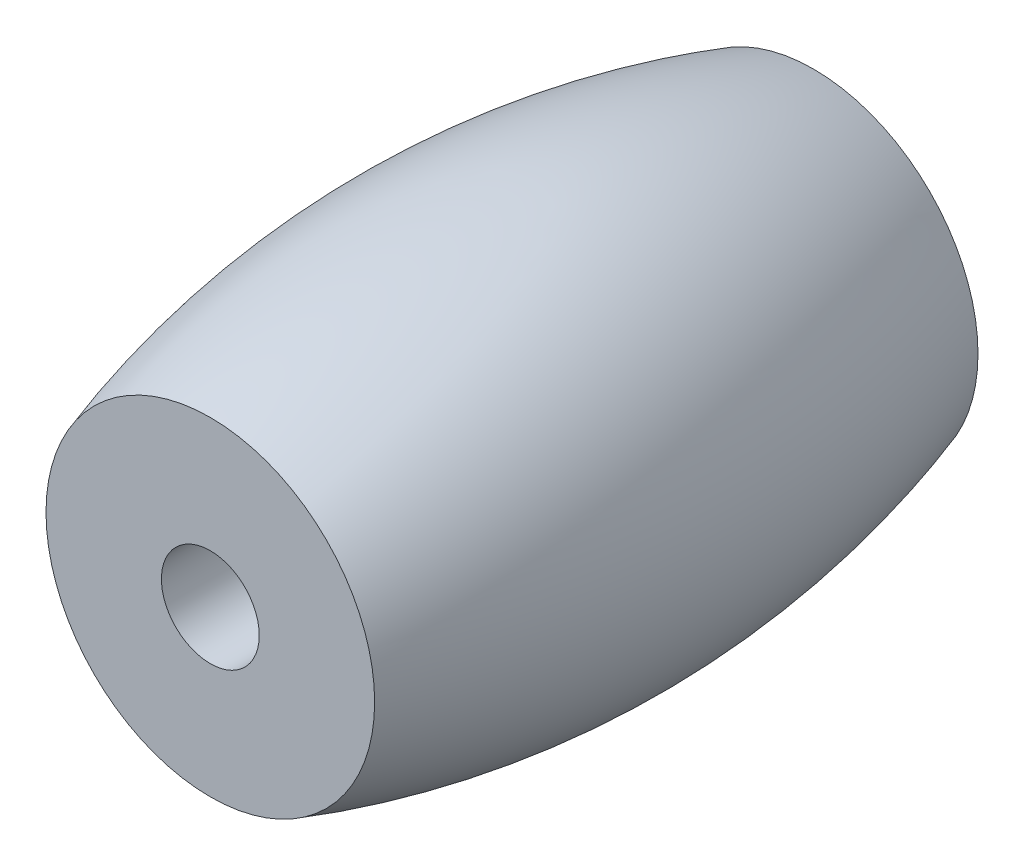
ISO-10303-21;
HEADER;
FILE_DESCRIPTION(('STEP AP214'),'2;1');
FILE_NAME('part.step','',(''),(''),'','','');
FILE_SCHEMA(('AUTOMOTIVE_DESIGN { 1 0 10303 214 1 1 1 1 }'));
ENDSEC;
DATA;
#1=APPLICATION_CONTEXT('core data for automotive mechanical design processes');
#2=APPLICATION_PROTOCOL_DEFINITION('international standard','automotive_design',2000,#1);
#3=PRODUCT_CONTEXT('',#1,'mechanical');
#4=PRODUCT('Part','Part','',(#3));
#5=PRODUCT_RELATED_PRODUCT_CATEGORY('part','',(#4));
#6=PRODUCT_DEFINITION_FORMATION('','',#4);
#7=PRODUCT_DEFINITION_CONTEXT('part definition',#1,'design');
#8=PRODUCT_DEFINITION('design','',#6,#7);
#9=PRODUCT_DEFINITION_SHAPE('','',#8);
#10=(LENGTH_UNIT() NAMED_UNIT(*) SI_UNIT(.MILLI.,.METRE.));
#11=(NAMED_UNIT(*) PLANE_ANGLE_UNIT() SI_UNIT($,.RADIAN.));
#12=(NAMED_UNIT(*) SI_UNIT($,.STERADIAN.) SOLID_ANGLE_UNIT());
#13=UNCERTAINTY_MEASURE_WITH_UNIT(LENGTH_MEASURE(1.E-05),#10,'distance_accuracy_value','');
#14=(GEOMETRIC_REPRESENTATION_CONTEXT(3) GLOBAL_UNCERTAINTY_ASSIGNED_CONTEXT((#13)) GLOBAL_UNIT_ASSIGNED_CONTEXT((#10,
#11,#12)) REPRESENTATION_CONTEXT('',''));
#15=CARTESIAN_POINT('',(0.,0.,0.));
#16=DIRECTION('',(0.,0.,1.));
#17=DIRECTION('',(1.,0.,0.));
#18=AXIS2_PLACEMENT_3D('',#15,#16,#17);
#19=CARTESIAN_POINT('',(1.5,0.,0.));
#20=DIRECTION('',(0.,0.,1.));
#21=DIRECTION('',(1.,0.,0.));
#22=AXIS2_PLACEMENT_3D('',#19,#20,#21);
#23=PLANE('',#22);
#24=CARTESIAN_POINT('',(0.,0.,0.));
#25=DIRECTION('',(0.,0.,1.));
#26=DIRECTION('',(1.,0.,0.));
#27=AXIS2_PLACEMENT_3D('',#24,#25,#26);
#28=CIRCLE('',#27,5.03835138896429);
#29=CARTESIAN_POINT('',(5.03835138896429,0.,0.));
#30=VERTEX_POINT('',#29);
#31=EDGE_CURVE('E46',#30,#30,#28,.T.);
#32=ORIENTED_EDGE('',*,*,#31,.T.);
#33=EDGE_LOOP('',(#32));
#34=FACE_BOUND('',#33,.T.);
#35=CARTESIAN_POINT('',(0.,0.,0.));
#36=DIRECTION('',(0.,0.,1.));
#37=DIRECTION('',(1.,0.,0.));
#38=AXIS2_PLACEMENT_3D('',#35,#36,#37);
#39=CIRCLE('',#38,1.5);
#40=CARTESIAN_POINT('',(1.5,0.,0.));
#41=VERTEX_POINT('',#40);
#42=EDGE_CURVE('E10',#41,#41,#39,.T.);
#43=ORIENTED_EDGE('',*,*,#42,.F.);
#44=EDGE_LOOP('',(#43));
#45=FACE_BOUND('',#44,.T.);
#46=ADVANCED_FACE('F32',(#34,#45),#23,.T.);
#47=CARTESIAN_POINT('',(0.,0.,0.));
#48=DIRECTION('',(0.,0.,1.));
#49=DIRECTION('',(1.,0.,0.));
#50=AXIS2_PLACEMENT_3D('',#47,#48,#49);
#51=CYLINDRICAL_SURFACE('',#50,1.5);
#52=ORIENTED_EDGE('',*,*,#42,.T.);
#53=EDGE_LOOP('',(#52));
#54=FACE_BOUND('',#53,.T.);
#55=CARTESIAN_POINT('',(0.,0.,-18.5));
#56=DIRECTION('',(0.,0.,1.));
#57=DIRECTION('',(1.,0.,0.));
#58=AXIS2_PLACEMENT_3D('',#55,#56,#57);
#59=CIRCLE('',#58,1.5);
#60=CARTESIAN_POINT('',(1.5,0.,-18.5));
#61=VERTEX_POINT('',#60);
#62=EDGE_CURVE('E38',#61,#61,#59,.T.);
#63=ORIENTED_EDGE('',*,*,#62,.F.);
#64=EDGE_LOOP('',(#63));
#65=FACE_BOUND('',#64,.T.);
#66=ADVANCED_FACE('F62',(#54,#65),#51,.F.);
#67=CARTESIAN_POINT('',(1.5,0.,-18.5));
#68=DIRECTION('',(0.,0.,-1.));
#69=DIRECTION('',(-1.,0.,0.));
#70=AXIS2_PLACEMENT_3D('',#67,#68,#69);
#71=PLANE('',#70);
#72=ORIENTED_EDGE('',*,*,#62,.T.);
#73=EDGE_LOOP('',(#72));
#74=FACE_BOUND('',#73,.T.);
#75=CARTESIAN_POINT('',(0.,0.,-18.5));
#76=DIRECTION('',(0.,0.,1.));
#77=DIRECTION('',(1.,0.,0.));
#78=AXIS2_PLACEMENT_3D('',#75,#76,#77);
#79=CIRCLE('',#78,5.03835138896429);
#80=CARTESIAN_POINT('',(5.03835138896429,0.,-18.5));
#81=VERTEX_POINT('',#80);
#82=EDGE_CURVE('E42',#81,#81,#79,.T.);
#83=ORIENTED_EDGE('',*,*,#82,.F.);
#84=EDGE_LOOP('',(#83));
#85=FACE_BOUND('',#84,.T.);
#86=ADVANCED_FACE('F56',(#74,#85),#71,.T.);
#87=CARTESIAN_POINT('',(0.,0.,-9.25));
#88=DIRECTION('',(0.,0.,1.));
#89=DIRECTION('',(1.,0.,0.));
#90=AXIS2_PLACEMENT_3D('',#87,#88,#89);
#91=DEGENERATE_TOROIDAL_SURFACE('',#90,23.5,30.,.F.);
#92=ORIENTED_EDGE('',*,*,#82,.T.);
#93=EDGE_LOOP('',(#92));
#94=FACE_BOUND('',#93,.T.);
#95=ORIENTED_EDGE('',*,*,#31,.F.);
#96=EDGE_LOOP('',(#95));
#97=FACE_BOUND('',#96,.T.);
#98=ADVANCED_FACE('F54',(#94,#97),#91,.F.);
#99=CLOSED_SHELL('',(#46,#66,#86,#98));
#100=MANIFOLD_SOLID_BREP('B2',#99);
#101=ADVANCED_BREP_SHAPE_REPRESENTATION('',(#18,#100),#14);
#102=SHAPE_DEFINITION_REPRESENTATION(#9,#101);
ENDSEC;
END-ISO-10303-21;
